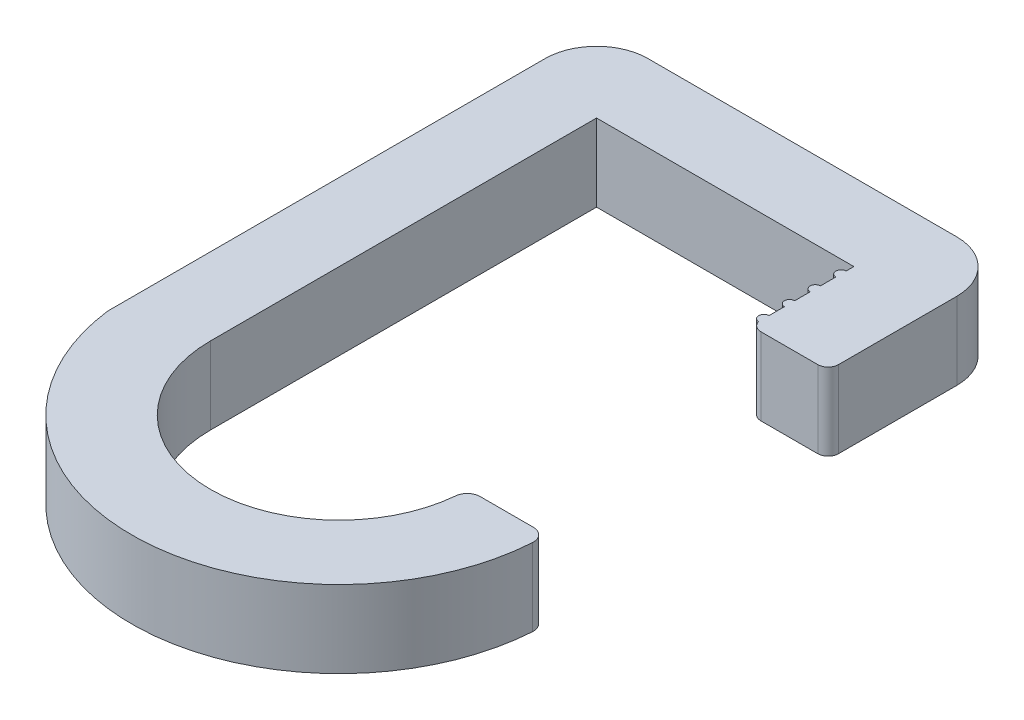
ISO-10303-21;
HEADER;
FILE_DESCRIPTION(('STEP AP214'),'2;1');
FILE_NAME('part.step','',(''),(''),'','','');
FILE_SCHEMA(('AUTOMOTIVE_DESIGN { 1 0 10303 214 1 1 1 1 }'));
ENDSEC;
DATA;
#1=APPLICATION_CONTEXT('core data for automotive mechanical design processes');
#2=APPLICATION_PROTOCOL_DEFINITION('international standard','automotive_design',2000,#1);
#3=PRODUCT_CONTEXT('',#1,'mechanical');
#4=PRODUCT('Part','Part','',(#3));
#5=PRODUCT_RELATED_PRODUCT_CATEGORY('part','',(#4));
#6=PRODUCT_DEFINITION_FORMATION('','',#4);
#7=PRODUCT_DEFINITION_CONTEXT('part definition',#1,'design');
#8=PRODUCT_DEFINITION('design','',#6,#7);
#9=PRODUCT_DEFINITION_SHAPE('','',#8);
#10=(LENGTH_UNIT() NAMED_UNIT(*) SI_UNIT(.MILLI.,.METRE.));
#11=(NAMED_UNIT(*) PLANE_ANGLE_UNIT() SI_UNIT($,.RADIAN.));
#12=(NAMED_UNIT(*) SI_UNIT($,.STERADIAN.) SOLID_ANGLE_UNIT());
#13=UNCERTAINTY_MEASURE_WITH_UNIT(LENGTH_MEASURE(1.E-05),#10,'distance_accuracy_value','');
#14=(GEOMETRIC_REPRESENTATION_CONTEXT(3) GLOBAL_UNCERTAINTY_ASSIGNED_CONTEXT((#13)) GLOBAL_UNIT_ASSIGNED_CONTEXT((#10,
#11,#12)) REPRESENTATION_CONTEXT('',''));
#15=CARTESIAN_POINT('',(0.,0.,0.));
#16=DIRECTION('',(0.,0.,1.));
#17=DIRECTION('',(1.,0.,0.));
#18=AXIS2_PLACEMENT_3D('',#15,#16,#17);
#19=CARTESIAN_POINT('',(40.,15.,75.));
#20=DIRECTION('',(0.,-1.,0.));
#21=DIRECTION('',(0.,0.,-1.));
#22=AXIS2_PLACEMENT_3D('',#19,#20,#21);
#23=CYLINDRICAL_SURFACE('',#22,40.3112887414927);
#24=CARTESIAN_POINT('',(40.,0.,75.));
#25=DIRECTION('',(0.,1.,0.));
#26=DIRECTION('',(0.,0.,1.));
#27=AXIS2_PLACEMENT_3D('',#24,#25,#26);
#28=CIRCLE('',#27,40.3112887414927);
#29=CARTESIAN_POINT('',(0.,0.,80.));
#30=VERTEX_POINT('',#29);
#31=CARTESIAN_POINT('',(80.223080500575,0.,77.6652945511255));
#32=VERTEX_POINT('',#31);
#33=EDGE_CURVE('E244',#30,#32,#28,.T.);
#34=ORIENTED_EDGE('',*,*,#33,.T.);
#35=DIRECTION('',(0.,-1.,0.));
#36=VECTOR('',#35,1.);
#37=CARTESIAN_POINT('',(80.223080500575,15.,77.6652945511255));
#38=LINE('',#37,#36);
#39=CARTESIAN_POINT('',(80.223080500575,15.,77.6652945511255));
#40=VERTEX_POINT('',#39);
#41=EDGE_CURVE('E56',#32,#40,#38,.F.);
#42=ORIENTED_EDGE('',*,*,#41,.T.);
#43=CARTESIAN_POINT('',(40.,15.,75.));
#44=DIRECTION('',(0.,1.,0.));
#45=DIRECTION('',(0.,0.,1.));
#46=AXIS2_PLACEMENT_3D('',#43,#44,#45);
#47=CIRCLE('',#46,40.3112887414927);
#48=CARTESIAN_POINT('',(0.,15.,80.));
#49=VERTEX_POINT('',#48);
#50=EDGE_CURVE('E192',#49,#40,#47,.T.);
#51=ORIENTED_EDGE('',*,*,#50,.F.);
#52=DIRECTION('',(0.,-1.,0.));
#53=VECTOR('',#52,1.);
#54=CARTESIAN_POINT('',(0.,15.,80.));
#55=LINE('',#54,#53);
#56=EDGE_CURVE('E203',#49,#30,#55,.T.);
#57=ORIENTED_EDGE('',*,*,#56,.T.);
#58=EDGE_LOOP('',(#34,#42,#51,#57));
#59=FACE_BOUND('',#58,.T.);
#60=ADVANCED_FACE('F33',(#59),#23,.T.);
#61=CARTESIAN_POINT('',(65.,15.,75.));
#62=DIRECTION('',(0.,0.,1.));
#63=DIRECTION('',(1.,0.,0.));
#64=AXIS2_PLACEMENT_3D('',#61,#62,#63);
#65=PLANE('',#64);
#66=DIRECTION('',(-1.,0.,0.));
#67=VECTOR('',#66,1.);
#68=CARTESIAN_POINT('',(65.,15.,75.));
#69=LINE('',#68,#67);
#70=CARTESIAN_POINT('',(77.7285509434504,15.,75.));
#71=VERTEX_POINT('',#70);
#72=CARTESIAN_POINT('',(67.3861278752583,15.,75.));
#73=VERTEX_POINT('',#72);
#74=EDGE_CURVE('E210',#71,#73,#69,.T.);
#75=ORIENTED_EDGE('',*,*,#74,.F.);
#76=DIRECTION('',(0.,-1.,0.));
#77=VECTOR('',#76,1.);
#78=CARTESIAN_POINT('',(77.7285509434504,15.,75.));
#79=LINE('',#78,#77);
#80=CARTESIAN_POINT('',(77.7285509434504,0.,75.));
#81=VERTEX_POINT('',#80);
#82=EDGE_CURVE('E347',#71,#81,#79,.T.);
#83=ORIENTED_EDGE('',*,*,#82,.T.);
#84=DIRECTION('',(-1.,0.,0.));
#85=VECTOR('',#84,1.);
#86=CARTESIAN_POINT('',(65.,0.,75.));
#87=LINE('',#86,#85);
#88=CARTESIAN_POINT('',(67.3861278752583,0.,75.));
#89=VERTEX_POINT('',#88);
#90=EDGE_CURVE('E246',#81,#89,#87,.T.);
#91=ORIENTED_EDGE('',*,*,#90,.T.);
#92=DIRECTION('',(0.,-1.,0.));
#93=VECTOR('',#92,1.);
#94=CARTESIAN_POINT('',(67.3861278752583,15.,75.));
#95=LINE('',#94,#93);
#96=EDGE_CURVE('E345',#89,#73,#95,.F.);
#97=ORIENTED_EDGE('',*,*,#96,.T.);
#98=EDGE_LOOP('',(#75,#83,#91,#97));
#99=FACE_BOUND('',#98,.T.);
#100=ADVANCED_FACE('F359',(#99),#65,.F.);
#101=CARTESIAN_POINT('',(40.,15.,75.));
#102=DIRECTION('',(0.,-1.,0.));
#103=DIRECTION('',(0.,0.,-1.));
#104=AXIS2_PLACEMENT_3D('',#101,#102,#103);
#105=CYLINDRICAL_SURFACE('',#104,25.);
#106=CARTESIAN_POINT('',(40.,15.,75.));
#107=DIRECTION('',(0.,-1.,0.));
#108=DIRECTION('',(0.,0.,1.));
#109=AXIS2_PLACEMENT_3D('',#106,#107,#108);
#110=CIRCLE('',#109,25.);
#111=CARTESIAN_POINT('',(64.8964798865984,15.,77.2727272727273));
#112=VERTEX_POINT('',#111);
#113=CARTESIAN_POINT('',(15.,15.,75.));
#114=VERTEX_POINT('',#113);
#115=EDGE_CURVE('E212',#112,#114,#110,.T.);
#116=ORIENTED_EDGE('',*,*,#115,.F.);
#117=DIRECTION('',(0.,-1.,0.));
#118=VECTOR('',#117,1.);
#119=CARTESIAN_POINT('',(64.8964798865984,15.,77.2727272727273));
#120=LINE('',#119,#118);
#121=CARTESIAN_POINT('',(64.8964798865984,0.,77.2727272727273));
#122=VERTEX_POINT('',#121);
#123=EDGE_CURVE('E11',#112,#122,#120,.T.);
#124=ORIENTED_EDGE('',*,*,#123,.T.);
#125=CARTESIAN_POINT('',(40.,0.,75.));
#126=DIRECTION('',(0.,-1.,0.));
#127=DIRECTION('',(0.,0.,1.));
#128=AXIS2_PLACEMENT_3D('',#125,#126,#127);
#129=CIRCLE('',#128,25.);
#130=CARTESIAN_POINT('',(15.,0.,75.));
#131=VERTEX_POINT('',#130);
#132=EDGE_CURVE('E249',#122,#131,#129,.T.);
#133=ORIENTED_EDGE('',*,*,#132,.T.);
#134=DIRECTION('',(0.,-1.,0.));
#135=VECTOR('',#134,1.);
#136=CARTESIAN_POINT('',(15.,15.,75.));
#137=LINE('',#136,#135);
#138=EDGE_CURVE('E208',#114,#131,#137,.T.);
#139=ORIENTED_EDGE('',*,*,#138,.F.);
#140=EDGE_LOOP('',(#116,#124,#133,#139));
#141=FACE_BOUND('',#140,.T.);
#142=ADVANCED_FACE('F369',(#141),#105,.F.);
#143=CARTESIAN_POINT('',(15.,15.,0.));
#144=DIRECTION('',(-1.,0.,0.));
#145=DIRECTION('',(0.,0.,1.));
#146=AXIS2_PLACEMENT_3D('',#143,#144,#145);
#147=PLANE('',#146);
#148=DIRECTION('',(0.,0.,-1.));
#149=VECTOR('',#148,1.);
#150=CARTESIAN_POINT('',(15.,0.,0.));
#151=LINE('',#150,#149);
#152=CARTESIAN_POINT('',(15.,0.,0.));
#153=VERTEX_POINT('',#152);
#154=EDGE_CURVE('E251',#131,#153,#151,.T.);
#155=ORIENTED_EDGE('',*,*,#154,.T.);
#156=DIRECTION('',(0.,-1.,0.));
#157=VECTOR('',#156,1.);
#158=CARTESIAN_POINT('',(15.,15.,0.));
#159=LINE('',#158,#157);
#160=CARTESIAN_POINT('',(15.,15.,0.));
#161=VERTEX_POINT('',#160);
#162=EDGE_CURVE('E307',#161,#153,#159,.T.);
#163=ORIENTED_EDGE('',*,*,#162,.F.);
#164=DIRECTION('',(0.,0.,-1.));
#165=VECTOR('',#164,1.);
#166=CARTESIAN_POINT('',(15.,15.,50.));
#167=LINE('',#166,#165);
#168=EDGE_CURVE('E216',#114,#161,#167,.T.);
#169=ORIENTED_EDGE('',*,*,#168,.F.);
#170=ORIENTED_EDGE('',*,*,#138,.T.);
#171=EDGE_LOOP('',(#155,#163,#169,#170));
#172=FACE_BOUND('',#171,.T.);
#173=ADVANCED_FACE('F377',(#172),#147,.F.);
#174=CARTESIAN_POINT('',(15.,15.,0.));
#175=DIRECTION('',(0.,0.,-1.));
#176=DIRECTION('',(-1.,0.,0.));
#177=AXIS2_PLACEMENT_3D('',#174,#175,#176);
#178=PLANE('',#177);
#179=DIRECTION('',(1.,0.,0.));
#180=VECTOR('',#179,1.);
#181=CARTESIAN_POINT('',(15.,0.,0.));
#182=LINE('',#181,#180);
#183=CARTESIAN_POINT('',(65.,0.,0.));
#184=VERTEX_POINT('',#183);
#185=EDGE_CURVE('E253',#153,#184,#182,.T.);
#186=ORIENTED_EDGE('',*,*,#185,.T.);
#187=DIRECTION('',(0.,-1.,0.));
#188=VECTOR('',#187,1.);
#189=CARTESIAN_POINT('',(65.,15.,0.));
#190=LINE('',#189,#188);
#191=CARTESIAN_POINT('',(65.,15.,0.));
#192=VERTEX_POINT('',#191);
#193=EDGE_CURVE('E304',#192,#184,#190,.T.);
#194=ORIENTED_EDGE('',*,*,#193,.F.);
#195=DIRECTION('',(1.,0.,0.));
#196=VECTOR('',#195,1.);
#197=CARTESIAN_POINT('',(15.,15.,0.));
#198=LINE('',#197,#196);
#199=EDGE_CURVE('E218',#161,#192,#198,.T.);
#200=ORIENTED_EDGE('',*,*,#199,.F.);
#201=ORIENTED_EDGE('',*,*,#162,.T.);
#202=EDGE_LOOP('',(#186,#194,#200,#201));
#203=FACE_BOUND('',#202,.T.);
#204=ADVANCED_FACE('F383',(#203),#178,.F.);
#205=CARTESIAN_POINT('',(65.,15.,0.));
#206=DIRECTION('',(1.,0.,0.));
#207=DIRECTION('',(0.,0.,-1.));
#208=AXIS2_PLACEMENT_3D('',#205,#206,#207);
#209=PLANE('',#208);
#210=DIRECTION('',(0.,0.,1.));
#211=VECTOR('',#210,1.);
#212=CARTESIAN_POINT('',(65.,0.,0.));
#213=LINE('',#212,#211);
#214=CARTESIAN_POINT('',(65.,0.,1.5));
#215=VERTEX_POINT('',#214);
#216=EDGE_CURVE('E255',#184,#215,#213,.T.);
#217=ORIENTED_EDGE('',*,*,#216,.T.);
#218=DIRECTION('',(0.,-1.,0.));
#219=VECTOR('',#218,1.);
#220=CARTESIAN_POINT('',(65.,15.,1.5));
#221=LINE('',#220,#219);
#222=CARTESIAN_POINT('',(65.,15.,1.5));
#223=VERTEX_POINT('',#222);
#224=EDGE_CURVE('E301',#223,#215,#221,.T.);
#225=ORIENTED_EDGE('',*,*,#224,.F.);
#226=DIRECTION('',(0.,0.,1.));
#227=VECTOR('',#226,1.);
#228=CARTESIAN_POINT('',(65.,15.,0.));
#229=LINE('',#228,#227);
#230=EDGE_CURVE('E220',#192,#223,#229,.T.);
#231=ORIENTED_EDGE('',*,*,#230,.F.);
#232=ORIENTED_EDGE('',*,*,#193,.T.);
#233=EDGE_LOOP('',(#217,#225,#231,#232));
#234=FACE_BOUND('',#233,.T.);
#235=ADVANCED_FACE('F385',(#234),#209,.F.);
#236=CARTESIAN_POINT('',(65.,15.,2.5));
#237=DIRECTION('',(0.,-1.,0.));
#238=DIRECTION('',(0.,0.,-1.));
#239=AXIS2_PLACEMENT_3D('',#236,#237,#238);
#240=CYLINDRICAL_SURFACE('',#239,0.999999999999998);
#241=CARTESIAN_POINT('',(65.,0.,2.5));
#242=DIRECTION('',(0.,1.,0.));
#243=DIRECTION('',(0.,0.,1.));
#244=AXIS2_PLACEMENT_3D('',#241,#242,#243);
#245=CIRCLE('',#244,0.999999999999998);
#246=CARTESIAN_POINT('',(65.,0.,3.5));
#247=VERTEX_POINT('',#246);
#248=EDGE_CURVE('E257',#215,#247,#245,.T.);
#249=ORIENTED_EDGE('',*,*,#248,.T.);
#250=DIRECTION('',(0.,-1.,0.));
#251=VECTOR('',#250,1.);
#252=CARTESIAN_POINT('',(65.,15.,3.5));
#253=LINE('',#252,#251);
#254=CARTESIAN_POINT('',(65.,15.,3.5));
#255=VERTEX_POINT('',#254);
#256=EDGE_CURVE('E298',#255,#247,#253,.T.);
#257=ORIENTED_EDGE('',*,*,#256,.F.);
#258=CARTESIAN_POINT('',(65.,15.,2.5));
#259=DIRECTION('',(0.,1.,0.));
#260=DIRECTION('',(0.,0.,1.));
#261=AXIS2_PLACEMENT_3D('',#258,#259,#260);
#262=CIRCLE('',#261,0.999999999999998);
#263=EDGE_CURVE('E222',#223,#255,#262,.T.);
#264=ORIENTED_EDGE('',*,*,#263,.F.);
#265=ORIENTED_EDGE('',*,*,#224,.T.);
#266=EDGE_LOOP('',(#249,#257,#264,#265));
#267=FACE_BOUND('',#266,.T.);
#268=ADVANCED_FACE('F390',(#267),#240,.T.);
#269=CARTESIAN_POINT('',(65.,15.,3.5));
#270=DIRECTION('',(1.,0.,0.));
#271=DIRECTION('',(0.,0.,-1.));
#272=AXIS2_PLACEMENT_3D('',#269,#270,#271);
#273=PLANE('',#272);
#274=DIRECTION('',(0.,0.,1.));
#275=VECTOR('',#274,1.);
#276=CARTESIAN_POINT('',(65.,0.,3.5));
#277=LINE('',#276,#275);
#278=CARTESIAN_POINT('',(65.,0.,6.5));
#279=VERTEX_POINT('',#278);
#280=EDGE_CURVE('E259',#247,#279,#277,.T.);
#281=ORIENTED_EDGE('',*,*,#280,.T.);
#282=DIRECTION('',(0.,-1.,0.));
#283=VECTOR('',#282,1.);
#284=CARTESIAN_POINT('',(65.,15.,6.5));
#285=LINE('',#284,#283);
#286=CARTESIAN_POINT('',(65.,15.,6.5));
#287=VERTEX_POINT('',#286);
#288=EDGE_CURVE('E295',#287,#279,#285,.T.);
#289=ORIENTED_EDGE('',*,*,#288,.F.);
#290=DIRECTION('',(0.,0.,1.));
#291=VECTOR('',#290,1.);
#292=CARTESIAN_POINT('',(65.,15.,3.5));
#293=LINE('',#292,#291);
#294=EDGE_CURVE('E224',#255,#287,#293,.T.);
#295=ORIENTED_EDGE('',*,*,#294,.F.);
#296=ORIENTED_EDGE('',*,*,#256,.T.);
#297=EDGE_LOOP('',(#281,#289,#295,#296));
#298=FACE_BOUND('',#297,.T.);
#299=ADVANCED_FACE('F396',(#298),#273,.F.);
#300=CARTESIAN_POINT('',(65.0000000000001,15.,7.5));
#301=DIRECTION('',(0.,-1.,0.));
#302=DIRECTION('',(0.,0.,-1.));
#303=AXIS2_PLACEMENT_3D('',#300,#301,#302);
#304=CYLINDRICAL_SURFACE('',#303,0.999999999999998);
#305=CARTESIAN_POINT('',(65.0000000000001,0.,7.5));
#306=DIRECTION('',(0.,1.,0.));
#307=DIRECTION('',(0.,0.,1.));
#308=AXIS2_PLACEMENT_3D('',#305,#306,#307);
#309=CIRCLE('',#308,0.999999999999998);
#310=CARTESIAN_POINT('',(65.,0.,8.5));
#311=VERTEX_POINT('',#310);
#312=EDGE_CURVE('E261',#279,#311,#309,.T.);
#313=ORIENTED_EDGE('',*,*,#312,.T.);
#314=DIRECTION('',(0.,-1.,0.));
#315=VECTOR('',#314,1.);
#316=CARTESIAN_POINT('',(65.,15.,8.5));
#317=LINE('',#316,#315);
#318=CARTESIAN_POINT('',(65.,15.,8.5));
#319=VERTEX_POINT('',#318);
#320=EDGE_CURVE('E292',#319,#311,#317,.T.);
#321=ORIENTED_EDGE('',*,*,#320,.F.);
#322=CARTESIAN_POINT('',(65.0000000000001,15.,7.5));
#323=DIRECTION('',(0.,1.,0.));
#324=DIRECTION('',(0.,0.,1.));
#325=AXIS2_PLACEMENT_3D('',#322,#323,#324);
#326=CIRCLE('',#325,0.999999999999998);
#327=EDGE_CURVE('E226',#287,#319,#326,.T.);
#328=ORIENTED_EDGE('',*,*,#327,.F.);
#329=ORIENTED_EDGE('',*,*,#288,.T.);
#330=EDGE_LOOP('',(#313,#321,#328,#329));
#331=FACE_BOUND('',#330,.T.);
#332=ADVANCED_FACE('F400',(#331),#304,.T.);
#333=CARTESIAN_POINT('',(65.,15.,8.5));
#334=DIRECTION('',(1.,0.,0.));
#335=DIRECTION('',(0.,0.,-1.));
#336=AXIS2_PLACEMENT_3D('',#333,#334,#335);
#337=PLANE('',#336);
#338=DIRECTION('',(0.,0.,1.));
#339=VECTOR('',#338,1.);
#340=CARTESIAN_POINT('',(65.,0.,8.5));
#341=LINE('',#340,#339);
#342=CARTESIAN_POINT('',(65.,0.,11.5));
#343=VERTEX_POINT('',#342);
#344=EDGE_CURVE('E263',#311,#343,#341,.T.);
#345=ORIENTED_EDGE('',*,*,#344,.T.);
#346=DIRECTION('',(0.,-1.,0.));
#347=VECTOR('',#346,1.);
#348=CARTESIAN_POINT('',(65.,15.,11.5));
#349=LINE('',#348,#347);
#350=CARTESIAN_POINT('',(65.,15.,11.5));
#351=VERTEX_POINT('',#350);
#352=EDGE_CURVE('E289',#351,#343,#349,.T.);
#353=ORIENTED_EDGE('',*,*,#352,.F.);
#354=DIRECTION('',(0.,0.,1.));
#355=VECTOR('',#354,1.);
#356=CARTESIAN_POINT('',(65.,15.,8.5));
#357=LINE('',#356,#355);
#358=EDGE_CURVE('E228',#319,#351,#357,.T.);
#359=ORIENTED_EDGE('',*,*,#358,.F.);
#360=ORIENTED_EDGE('',*,*,#320,.T.);
#361=EDGE_LOOP('',(#345,#353,#359,#360));
#362=FACE_BOUND('',#361,.T.);
#363=ADVANCED_FACE('F405',(#362),#337,.F.);
#364=CARTESIAN_POINT('',(65.0000000000001,15.,12.5));
#365=DIRECTION('',(0.,-1.,0.));
#366=DIRECTION('',(0.,0.,-1.));
#367=AXIS2_PLACEMENT_3D('',#364,#365,#366);
#368=CYLINDRICAL_SURFACE('',#367,0.999999999999997);
#369=CARTESIAN_POINT('',(65.0000000000001,0.,12.5));
#370=DIRECTION('',(0.,1.,0.));
#371=DIRECTION('',(0.,0.,1.));
#372=AXIS2_PLACEMENT_3D('',#369,#370,#371);
#373=CIRCLE('',#372,0.999999999999997);
#374=CARTESIAN_POINT('',(65.,0.,13.5));
#375=VERTEX_POINT('',#374);
#376=EDGE_CURVE('E265',#343,#375,#373,.T.);
#377=ORIENTED_EDGE('',*,*,#376,.T.);
#378=DIRECTION('',(0.,-1.,0.));
#379=VECTOR('',#378,1.);
#380=CARTESIAN_POINT('',(65.,15.,13.5));
#381=LINE('',#380,#379);
#382=CARTESIAN_POINT('',(65.,15.,13.5));
#383=VERTEX_POINT('',#382);
#384=EDGE_CURVE('E286',#383,#375,#381,.T.);
#385=ORIENTED_EDGE('',*,*,#384,.F.);
#386=CARTESIAN_POINT('',(65.0000000000001,15.,12.5));
#387=DIRECTION('',(0.,1.,0.));
#388=DIRECTION('',(0.,0.,1.));
#389=AXIS2_PLACEMENT_3D('',#386,#387,#388);
#390=CIRCLE('',#389,0.999999999999997);
#391=EDGE_CURVE('E230',#351,#383,#390,.T.);
#392=ORIENTED_EDGE('',*,*,#391,.F.);
#393=ORIENTED_EDGE('',*,*,#352,.T.);
#394=EDGE_LOOP('',(#377,#385,#392,#393));
#395=FACE_BOUND('',#394,.T.);
#396=ADVANCED_FACE('F411',(#395),#368,.T.);
#397=CARTESIAN_POINT('',(65.,15.,13.5));
#398=DIRECTION('',(1.,0.,0.));
#399=DIRECTION('',(0.,0.,-1.));
#400=AXIS2_PLACEMENT_3D('',#397,#398,#399);
#401=PLANE('',#400);
#402=DIRECTION('',(0.,0.,1.));
#403=VECTOR('',#402,1.);
#404=CARTESIAN_POINT('',(65.,0.,13.5));
#405=LINE('',#404,#403);
#406=CARTESIAN_POINT('',(65.,0.,16.5));
#407=VERTEX_POINT('',#406);
#408=EDGE_CURVE('E267',#375,#407,#405,.T.);
#409=ORIENTED_EDGE('',*,*,#408,.T.);
#410=DIRECTION('',(0.,-1.,0.));
#411=VECTOR('',#410,1.);
#412=CARTESIAN_POINT('',(65.,15.,16.5));
#413=LINE('',#412,#411);
#414=CARTESIAN_POINT('',(65.,15.,16.5));
#415=VERTEX_POINT('',#414);
#416=EDGE_CURVE('E283',#415,#407,#413,.T.);
#417=ORIENTED_EDGE('',*,*,#416,.F.);
#418=DIRECTION('',(0.,0.,1.));
#419=VECTOR('',#418,1.);
#420=CARTESIAN_POINT('',(65.,15.,13.5));
#421=LINE('',#420,#419);
#422=EDGE_CURVE('E232',#383,#415,#421,.T.);
#423=ORIENTED_EDGE('',*,*,#422,.F.);
#424=ORIENTED_EDGE('',*,*,#384,.T.);
#425=EDGE_LOOP('',(#409,#417,#423,#424));
#426=FACE_BOUND('',#425,.T.);
#427=ADVANCED_FACE('F415',(#426),#401,.F.);
#428=CARTESIAN_POINT('',(65.0000000000002,15.,17.5));
#429=DIRECTION('',(0.,-1.,0.));
#430=DIRECTION('',(0.,0.,-1.));
#431=AXIS2_PLACEMENT_3D('',#428,#429,#430);
#432=CYLINDRICAL_SURFACE('',#431,0.999999999999997);
#433=CARTESIAN_POINT('',(65.0000000000002,0.,17.5));
#434=DIRECTION('',(0.,1.,0.));
#435=DIRECTION('',(0.,0.,1.));
#436=AXIS2_PLACEMENT_3D('',#433,#434,#435);
#437=CIRCLE('',#436,0.999999999999997);
#438=CARTESIAN_POINT('',(65.,0.,18.5));
#439=VERTEX_POINT('',#438);
#440=EDGE_CURVE('E269',#407,#439,#437,.T.);
#441=ORIENTED_EDGE('',*,*,#440,.T.);
#442=DIRECTION('',(0.,-1.,0.));
#443=VECTOR('',#442,1.);
#444=CARTESIAN_POINT('',(65.,15.,18.5));
#445=LINE('',#444,#443);
#446=CARTESIAN_POINT('',(65.,15.,18.5));
#447=VERTEX_POINT('',#446);
#448=EDGE_CURVE('E243',#447,#439,#445,.T.);
#449=ORIENTED_EDGE('',*,*,#448,.F.);
#450=CARTESIAN_POINT('',(65.0000000000002,15.,17.5));
#451=DIRECTION('',(0.,1.,0.));
#452=DIRECTION('',(0.,0.,1.));
#453=AXIS2_PLACEMENT_3D('',#450,#451,#452);
#454=CIRCLE('',#453,0.999999999999997);
#455=EDGE_CURVE('E234',#415,#447,#454,.T.);
#456=ORIENTED_EDGE('',*,*,#455,.F.);
#457=ORIENTED_EDGE('',*,*,#416,.T.);
#458=EDGE_LOOP('',(#441,#449,#456,#457));
#459=FACE_BOUND('',#458,.T.);
#460=ADVANCED_FACE('F420',(#459),#432,.T.);
#461=CARTESIAN_POINT('',(80.,15.,20.));
#462=DIRECTION('',(0.,0.,-1.));
#463=DIRECTION('',(-1.,0.,0.));
#464=AXIS2_PLACEMENT_3D('',#461,#462,#463);
#465=PLANE('',#464);
#466=DIRECTION('',(1.,0.,0.));
#467=VECTOR('',#466,1.);
#468=CARTESIAN_POINT('',(80.,0.,20.));
#469=LINE('',#468,#467);
#470=CARTESIAN_POINT('',(66.9364916731037,0.,20.));
#471=VERTEX_POINT('',#470);
#472=CARTESIAN_POINT('',(78.,0.,20.));
#473=VERTEX_POINT('',#472);
#474=EDGE_CURVE('E272',#471,#473,#469,.T.);
#475=ORIENTED_EDGE('',*,*,#474,.T.);
#476=DIRECTION('',(0.,-1.,0.));
#477=VECTOR('',#476,1.);
#478=CARTESIAN_POINT('',(78.,15.,20.));
#479=LINE('',#478,#477);
#480=CARTESIAN_POINT('',(78.,15.,20.));
#481=VERTEX_POINT('',#480);
#482=EDGE_CURVE('E339',#473,#481,#479,.F.);
#483=ORIENTED_EDGE('',*,*,#482,.T.);
#484=DIRECTION('',(1.,0.,0.));
#485=VECTOR('',#484,1.);
#486=CARTESIAN_POINT('',(80.,15.,20.));
#487=LINE('',#486,#485);
#488=CARTESIAN_POINT('',(66.9364916731037,15.,20.));
#489=VERTEX_POINT('',#488);
#490=EDGE_CURVE('E236',#489,#481,#487,.T.);
#491=ORIENTED_EDGE('',*,*,#490,.F.);
#492=DIRECTION('',(0.,-1.,0.));
#493=VECTOR('',#492,1.);
#494=CARTESIAN_POINT('',(66.9364916731037,15.,20.));
#495=LINE('',#494,#493);
#496=EDGE_CURVE('E336',#489,#471,#495,.T.);
#497=ORIENTED_EDGE('',*,*,#496,.T.);
#498=EDGE_LOOP('',(#475,#483,#491,#497));
#499=FACE_BOUND('',#498,.T.);
#500=ADVANCED_FACE('F427',(#499),#465,.F.);
#501=CARTESIAN_POINT('',(80.,15.,0.));
#502=DIRECTION('',(-1.,0.,0.));
#503=DIRECTION('',(0.,0.,1.));
#504=AXIS2_PLACEMENT_3D('',#501,#502,#503);
#505=PLANE('',#504);
#506=DIRECTION('',(0.,0.,-1.));
#507=VECTOR('',#506,1.);
#508=CARTESIAN_POINT('',(80.,15.,0.));
#509=LINE('',#508,#507);
#510=CARTESIAN_POINT('',(80.,15.,18.));
#511=VERTEX_POINT('',#510);
#512=CARTESIAN_POINT('',(80.,15.,-5.));
#513=VERTEX_POINT('',#512);
#514=EDGE_CURVE('E239',#511,#513,#509,.T.);
#515=ORIENTED_EDGE('',*,*,#514,.F.);
#516=DIRECTION('',(0.,-1.,0.));
#517=VECTOR('',#516,1.);
#518=CARTESIAN_POINT('',(80.,15.,18.));
#519=LINE('',#518,#517);
#520=CARTESIAN_POINT('',(80.,0.,18.));
#521=VERTEX_POINT('',#520);
#522=EDGE_CURVE('E329',#511,#521,#519,.T.);
#523=ORIENTED_EDGE('',*,*,#522,.T.);
#524=DIRECTION('',(0.,0.,-1.));
#525=VECTOR('',#524,1.);
#526=CARTESIAN_POINT('',(80.,0.,0.));
#527=LINE('',#526,#525);
#528=CARTESIAN_POINT('',(80.,0.,-5.));
#529=VERTEX_POINT('',#528);
#530=EDGE_CURVE('E275',#521,#529,#527,.T.);
#531=ORIENTED_EDGE('',*,*,#530,.T.);
#532=DIRECTION('',(0.,-1.,0.));
#533=VECTOR('',#532,1.);
#534=CARTESIAN_POINT('',(80.,15.,-5.));
#535=LINE('',#534,#533);
#536=EDGE_CURVE('E321',#529,#513,#535,.F.);
#537=ORIENTED_EDGE('',*,*,#536,.T.);
#538=EDGE_LOOP('',(#515,#523,#531,#537));
#539=FACE_BOUND('',#538,.T.);
#540=ADVANCED_FACE('F437',(#539),#505,.F.);
#541=CARTESIAN_POINT('',(0.,15.,-15.));
#542=DIRECTION('',(0.,0.,1.));
#543=DIRECTION('',(1.,0.,0.));
#544=AXIS2_PLACEMENT_3D('',#541,#542,#543);
#545=PLANE('',#544);
#546=DIRECTION('',(-1.,0.,0.));
#547=VECTOR('',#546,1.);
#548=CARTESIAN_POINT('',(0.,15.,-15.));
#549=LINE('',#548,#547);
#550=CARTESIAN_POINT('',(70.,15.,-15.));
#551=VERTEX_POINT('',#550);
#552=CARTESIAN_POINT('',(10.,15.,-15.));
#553=VERTEX_POINT('',#552);
#554=EDGE_CURVE('E241',#551,#553,#549,.T.);
#555=ORIENTED_EDGE('',*,*,#554,.F.);
#556=DIRECTION('',(0.,-1.,0.));
#557=VECTOR('',#556,1.);
#558=CARTESIAN_POINT('',(70.,15.,-15.));
#559=LINE('',#558,#557);
#560=CARTESIAN_POINT('',(70.,0.,-15.));
#561=VERTEX_POINT('',#560);
#562=EDGE_CURVE('E313',#551,#561,#559,.T.);
#563=ORIENTED_EDGE('',*,*,#562,.T.);
#564=DIRECTION('',(-1.,0.,0.));
#565=VECTOR('',#564,1.);
#566=CARTESIAN_POINT('',(0.,0.,-15.));
#567=LINE('',#566,#565);
#568=CARTESIAN_POINT('',(10.,0.,-15.));
#569=VERTEX_POINT('',#568);
#570=EDGE_CURVE('E277',#561,#569,#567,.T.);
#571=ORIENTED_EDGE('',*,*,#570,.T.);
#572=DIRECTION('',(0.,-1.,0.));
#573=VECTOR('',#572,1.);
#574=CARTESIAN_POINT('',(10.,15.,-15.));
#575=LINE('',#574,#573);
#576=EDGE_CURVE('E207',#569,#553,#575,.F.);
#577=ORIENTED_EDGE('',*,*,#576,.T.);
#578=EDGE_LOOP('',(#555,#563,#571,#577));
#579=FACE_BOUND('',#578,.T.);
#580=ADVANCED_FACE('F445',(#579),#545,.F.);
#581=CARTESIAN_POINT('',(0.,15.,0.));
#582=DIRECTION('',(1.,0.,0.));
#583=DIRECTION('',(0.,0.,-1.));
#584=AXIS2_PLACEMENT_3D('',#581,#582,#583);
#585=PLANE('',#584);
#586=DIRECTION('',(0.,0.,1.));
#587=VECTOR('',#586,1.);
#588=CARTESIAN_POINT('',(0.,15.,0.));
#589=LINE('',#588,#587);
#590=CARTESIAN_POINT('',(0.,15.,-5.));
#591=VERTEX_POINT('',#590);
#592=EDGE_CURVE('E189',#591,#49,#589,.T.);
#593=ORIENTED_EDGE('',*,*,#592,.F.);
#594=DIRECTION('',(0.,-1.,0.));
#595=VECTOR('',#594,1.);
#596=CARTESIAN_POINT('',(0.,15.,-5.));
#597=LINE('',#596,#595);
#598=CARTESIAN_POINT('',(0.,0.,-5.));
#599=VERTEX_POINT('',#598);
#600=EDGE_CURVE('E327',#591,#599,#597,.T.);
#601=ORIENTED_EDGE('',*,*,#600,.T.);
#602=DIRECTION('',(0.,0.,1.));
#603=VECTOR('',#602,1.);
#604=CARTESIAN_POINT('',(0.,0.,0.));
#605=LINE('',#604,#603);
#606=EDGE_CURVE('E200',#599,#30,#605,.T.);
#607=ORIENTED_EDGE('',*,*,#606,.T.);
#608=ORIENTED_EDGE('',*,*,#56,.F.);
#609=EDGE_LOOP('',(#593,#601,#607,#608));
#610=FACE_BOUND('',#609,.T.);
#611=ADVANCED_FACE('F204',(#610),#585,.F.);
#612=CARTESIAN_POINT('',(40.,15.,75.));
#613=DIRECTION('',(0.,1.,0.));
#614=DIRECTION('',(0.,0.,1.));
#615=AXIS2_PLACEMENT_3D('',#612,#613,#614);
#616=PLANE('',#615);
#617=ORIENTED_EDGE('',*,*,#50,.T.);
#618=CARTESIAN_POINT('',(77.7285509434504,15.,77.5));
#619=DIRECTION('',(0.,1.,0.));
#620=DIRECTION('',(0.,0.,1.));
#621=AXIS2_PLACEMENT_3D('',#618,#619,#620);
#622=CIRCLE('',#621,2.5);
#623=EDGE_CURVE('E41',#40,#71,#622,.T.);
#624=ORIENTED_EDGE('',*,*,#623,.T.);
#625=ORIENTED_EDGE('',*,*,#74,.T.);
#626=CARTESIAN_POINT('',(67.3861278752583,15.,77.5));
#627=DIRECTION('',(0.,1.,0.));
#628=DIRECTION('',(0.,0.,1.));
#629=AXIS2_PLACEMENT_3D('',#626,#627,#628);
#630=CIRCLE('',#629,2.5);
#631=EDGE_CURVE('E48',#73,#112,#630,.T.);
#632=ORIENTED_EDGE('',*,*,#631,.T.);
#633=ORIENTED_EDGE('',*,*,#115,.T.);
#634=ORIENTED_EDGE('',*,*,#168,.T.);
#635=ORIENTED_EDGE('',*,*,#199,.T.);
#636=ORIENTED_EDGE('',*,*,#230,.T.);
#637=ORIENTED_EDGE('',*,*,#263,.T.);
#638=ORIENTED_EDGE('',*,*,#294,.T.);
#639=ORIENTED_EDGE('',*,*,#327,.T.);
#640=ORIENTED_EDGE('',*,*,#358,.T.);
#641=ORIENTED_EDGE('',*,*,#391,.T.);
#642=ORIENTED_EDGE('',*,*,#422,.T.);
#643=ORIENTED_EDGE('',*,*,#455,.T.);
#644=CARTESIAN_POINT('',(66.9364916731037,15.,18.));
#645=DIRECTION('',(0.,1.,0.));
#646=DIRECTION('',(0.,0.,1.));
#647=AXIS2_PLACEMENT_3D('',#644,#645,#646);
#648=CIRCLE('',#647,2.);
#649=EDGE_CURVE('E341',#447,#489,#648,.T.);
#650=ORIENTED_EDGE('',*,*,#649,.T.);
#651=ORIENTED_EDGE('',*,*,#490,.T.);
#652=CARTESIAN_POINT('',(78.,15.,18.));
#653=DIRECTION('',(0.,1.,0.));
#654=DIRECTION('',(0.,0.,1.));
#655=AXIS2_PLACEMENT_3D('',#652,#653,#654);
#656=CIRCLE('',#655,2.);
#657=EDGE_CURVE('E343',#481,#511,#656,.T.);
#658=ORIENTED_EDGE('',*,*,#657,.T.);
#659=ORIENTED_EDGE('',*,*,#514,.T.);
#660=CARTESIAN_POINT('',(70.,15.,-5.));
#661=DIRECTION('',(0.,1.,0.));
#662=DIRECTION('',(0.,0.,1.));
#663=AXIS2_PLACEMENT_3D('',#660,#661,#662);
#664=CIRCLE('',#663,10.);
#665=EDGE_CURVE('E325',#513,#551,#664,.T.);
#666=ORIENTED_EDGE('',*,*,#665,.T.);
#667=ORIENTED_EDGE('',*,*,#554,.T.);
#668=CARTESIAN_POINT('',(10.,15.,-5.));
#669=DIRECTION('',(0.,1.,0.));
#670=DIRECTION('',(0.,0.,1.));
#671=AXIS2_PLACEMENT_3D('',#668,#669,#670);
#672=CIRCLE('',#671,10.);
#673=EDGE_CURVE('E196',#553,#591,#672,.T.);
#674=ORIENTED_EDGE('',*,*,#673,.T.);
#675=ORIENTED_EDGE('',*,*,#592,.T.);
#676=EDGE_LOOP('',(#617,#624,#625,#632,#633,#634,#635,#636,#637,#638,#639,#640,#641,#642,#643,
#650,#651,#658,#659,#666,#667,#674,#675));
#677=FACE_BOUND('',#676,.T.);
#678=ADVANCED_FACE('F191',(#677),#616,.T.);
#679=CARTESIAN_POINT('',(40.,0.,75.));
#680=DIRECTION('',(0.,1.,0.));
#681=DIRECTION('',(0.,0.,1.));
#682=AXIS2_PLACEMENT_3D('',#679,#680,#681);
#683=PLANE('',#682);
#684=ORIENTED_EDGE('',*,*,#90,.F.);
#685=CARTESIAN_POINT('',(77.7285509434504,0.,77.5));
#686=DIRECTION('',(0.,1.,0.));
#687=DIRECTION('',(0.,0.,1.));
#688=AXIS2_PLACEMENT_3D('',#685,#686,#687);
#689=CIRCLE('',#688,2.5);
#690=EDGE_CURVE('E352',#81,#32,#689,.F.);
#691=ORIENTED_EDGE('',*,*,#690,.T.);
#692=ORIENTED_EDGE('',*,*,#33,.F.);
#693=ORIENTED_EDGE('',*,*,#606,.F.);
#694=CARTESIAN_POINT('',(10.,0.,-5.));
#695=DIRECTION('',(0.,1.,0.));
#696=DIRECTION('',(0.,0.,1.));
#697=AXIS2_PLACEMENT_3D('',#694,#695,#696);
#698=CIRCLE('',#697,10.);
#699=EDGE_CURVE('E316',#599,#569,#698,.F.);
#700=ORIENTED_EDGE('',*,*,#699,.T.);
#701=ORIENTED_EDGE('',*,*,#570,.F.);
#702=CARTESIAN_POINT('',(70.,0.,-5.));
#703=DIRECTION('',(0.,1.,0.));
#704=DIRECTION('',(0.,0.,1.));
#705=AXIS2_PLACEMENT_3D('',#702,#703,#704);
#706=CIRCLE('',#705,10.);
#707=EDGE_CURVE('E318',#561,#529,#706,.F.);
#708=ORIENTED_EDGE('',*,*,#707,.T.);
#709=ORIENTED_EDGE('',*,*,#530,.F.);
#710=CARTESIAN_POINT('',(78.,0.,18.));
#711=DIRECTION('',(0.,1.,0.));
#712=DIRECTION('',(0.,0.,1.));
#713=AXIS2_PLACEMENT_3D('',#710,#711,#712);
#714=CIRCLE('',#713,2.);
#715=EDGE_CURVE('E334',#521,#473,#714,.F.);
#716=ORIENTED_EDGE('',*,*,#715,.T.);
#717=ORIENTED_EDGE('',*,*,#474,.F.);
#718=CARTESIAN_POINT('',(66.9364916731037,0.,18.));
#719=DIRECTION('',(0.,1.,0.));
#720=DIRECTION('',(0.,0.,1.));
#721=AXIS2_PLACEMENT_3D('',#718,#719,#720);
#722=CIRCLE('',#721,2.);
#723=EDGE_CURVE('E332',#471,#439,#722,.F.);
#724=ORIENTED_EDGE('',*,*,#723,.T.);
#725=ORIENTED_EDGE('',*,*,#440,.F.);
#726=ORIENTED_EDGE('',*,*,#408,.F.);
#727=ORIENTED_EDGE('',*,*,#376,.F.);
#728=ORIENTED_EDGE('',*,*,#344,.F.);
#729=ORIENTED_EDGE('',*,*,#312,.F.);
#730=ORIENTED_EDGE('',*,*,#280,.F.);
#731=ORIENTED_EDGE('',*,*,#248,.F.);
#732=ORIENTED_EDGE('',*,*,#216,.F.);
#733=ORIENTED_EDGE('',*,*,#185,.F.);
#734=ORIENTED_EDGE('',*,*,#154,.F.);
#735=ORIENTED_EDGE('',*,*,#132,.F.);
#736=CARTESIAN_POINT('',(67.3861278752583,0.,77.5));
#737=DIRECTION('',(0.,1.,0.));
#738=DIRECTION('',(0.,0.,1.));
#739=AXIS2_PLACEMENT_3D('',#736,#737,#738);
#740=CIRCLE('',#739,2.5);
#741=EDGE_CURVE('E350',#122,#89,#740,.F.);
#742=ORIENTED_EDGE('',*,*,#741,.T.);
#743=EDGE_LOOP('',(#684,#691,#692,#693,#700,#701,#708,#709,#716,#717,#724,#725,#726,#727,#728,
#729,#730,#731,#732,#733,#734,#735,#742));
#744=FACE_BOUND('',#743,.T.);
#745=ADVANCED_FACE('F364',(#744),#683,.F.);
#746=CARTESIAN_POINT('',(70.,15.,-5.));
#747=DIRECTION('',(0.,-1.,0.));
#748=DIRECTION('',(0.,0.,-1.));
#749=AXIS2_PLACEMENT_3D('',#746,#747,#748);
#750=CYLINDRICAL_SURFACE('',#749,10.);
#751=ORIENTED_EDGE('',*,*,#665,.F.);
#752=ORIENTED_EDGE('',*,*,#536,.F.);
#753=ORIENTED_EDGE('',*,*,#707,.F.);
#754=ORIENTED_EDGE('',*,*,#562,.F.);
#755=EDGE_LOOP('',(#751,#752,#753,#754));
#756=FACE_BOUND('',#755,.T.);
#757=ADVANCED_FACE('F442',(#756),#750,.T.);
#758=CARTESIAN_POINT('',(10.,15.,-5.));
#759=DIRECTION('',(0.,-1.,0.));
#760=DIRECTION('',(0.,0.,-1.));
#761=AXIS2_PLACEMENT_3D('',#758,#759,#760);
#762=CYLINDRICAL_SURFACE('',#761,10.);
#763=ORIENTED_EDGE('',*,*,#673,.F.);
#764=ORIENTED_EDGE('',*,*,#576,.F.);
#765=ORIENTED_EDGE('',*,*,#699,.F.);
#766=ORIENTED_EDGE('',*,*,#600,.F.);
#767=EDGE_LOOP('',(#763,#764,#765,#766));
#768=FACE_BOUND('',#767,.T.);
#769=ADVANCED_FACE('F449',(#768),#762,.T.);
#770=CARTESIAN_POINT('',(78.,15.,18.));
#771=DIRECTION('',(0.,-1.,0.));
#772=DIRECTION('',(0.,0.,-1.));
#773=AXIS2_PLACEMENT_3D('',#770,#771,#772);
#774=CYLINDRICAL_SURFACE('',#773,2.);
#775=ORIENTED_EDGE('',*,*,#657,.F.);
#776=ORIENTED_EDGE('',*,*,#482,.F.);
#777=ORIENTED_EDGE('',*,*,#715,.F.);
#778=ORIENTED_EDGE('',*,*,#522,.F.);
#779=EDGE_LOOP('',(#775,#776,#777,#778));
#780=FACE_BOUND('',#779,.T.);
#781=ADVANCED_FACE('F433',(#780),#774,.T.);
#782=CARTESIAN_POINT('',(66.9364916731037,15.,18.));
#783=DIRECTION('',(0.,-1.,0.));
#784=DIRECTION('',(0.,0.,-1.));
#785=AXIS2_PLACEMENT_3D('',#782,#783,#784);
#786=CYLINDRICAL_SURFACE('',#785,2.);
#787=ORIENTED_EDGE('',*,*,#649,.F.);
#788=ORIENTED_EDGE('',*,*,#448,.T.);
#789=ORIENTED_EDGE('',*,*,#723,.F.);
#790=ORIENTED_EDGE('',*,*,#496,.F.);
#791=EDGE_LOOP('',(#787,#788,#789,#790));
#792=FACE_BOUND('',#791,.T.);
#793=ADVANCED_FACE('F430',(#792),#786,.T.);
#794=CARTESIAN_POINT('',(77.7285509434504,15.,77.5));
#795=DIRECTION('',(0.,-1.,0.));
#796=DIRECTION('',(0.,0.,-1.));
#797=AXIS2_PLACEMENT_3D('',#794,#795,#796);
#798=CYLINDRICAL_SURFACE('',#797,2.5);
#799=ORIENTED_EDGE('',*,*,#623,.F.);
#800=ORIENTED_EDGE('',*,*,#41,.F.);
#801=ORIENTED_EDGE('',*,*,#690,.F.);
#802=ORIENTED_EDGE('',*,*,#82,.F.);
#803=EDGE_LOOP('',(#799,#800,#801,#802));
#804=FACE_BOUND('',#803,.T.);
#805=ADVANCED_FACE('F362',(#804),#798,.T.);
#806=CARTESIAN_POINT('',(67.3861278752583,15.,77.5));
#807=DIRECTION('',(0.,-1.,0.));
#808=DIRECTION('',(0.,0.,-1.));
#809=AXIS2_PLACEMENT_3D('',#806,#807,#808);
#810=CYLINDRICAL_SURFACE('',#809,2.5);
#811=ORIENTED_EDGE('',*,*,#631,.F.);
#812=ORIENTED_EDGE('',*,*,#96,.F.);
#813=ORIENTED_EDGE('',*,*,#741,.F.);
#814=ORIENTED_EDGE('',*,*,#123,.F.);
#815=EDGE_LOOP('',(#811,#812,#813,#814));
#816=FACE_BOUND('',#815,.T.);
#817=ADVANCED_FACE('F35',(#816),#810,.T.);
#818=CLOSED_SHELL('',(#60,#100,#142,#173,#204,#235,#268,#299,#332,#363,#396,#427,#460,#500,#540,
#580,#611,#678,#745,#757,#769,#781,#793,#805,#817));
#819=MANIFOLD_SOLID_BREP('B2',#818);
#820=ADVANCED_BREP_SHAPE_REPRESENTATION('',(#18,#819),#14);
#821=SHAPE_DEFINITION_REPRESENTATION(#9,#820);
ENDSEC;
END-ISO-10303-21;
